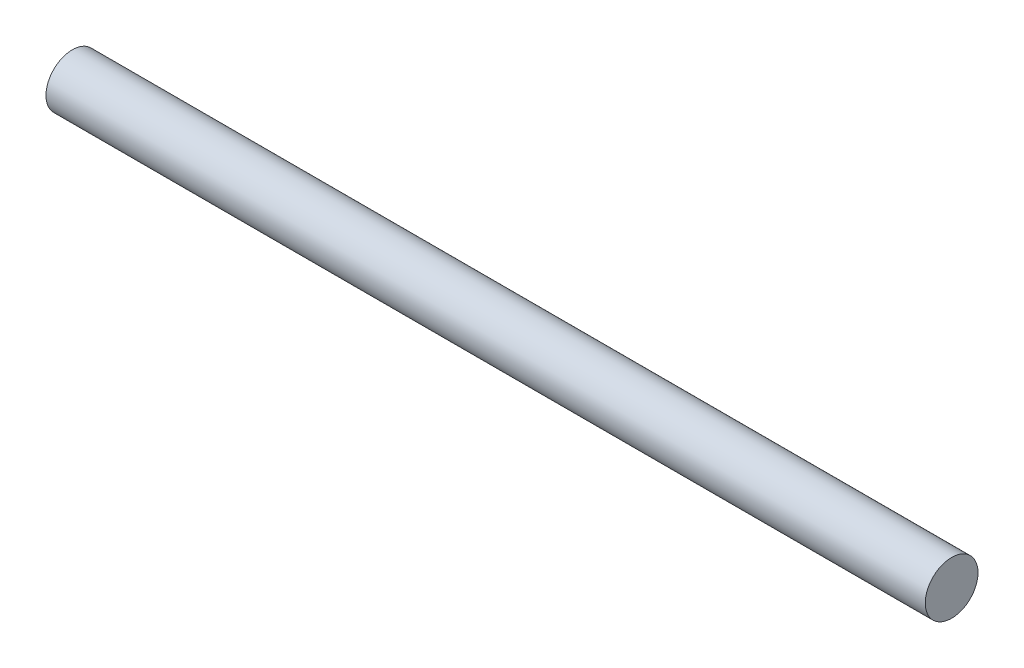
ISO-10303-21;
HEADER;
FILE_DESCRIPTION(('STEP AP214'),'2;1');
FILE_NAME('part.step','',(''),(''),'','','');
FILE_SCHEMA(('AUTOMOTIVE_DESIGN { 1 0 10303 214 1 1 1 1 }'));
ENDSEC;
DATA;
#1=APPLICATION_CONTEXT('core data for automotive mechanical design processes');
#2=APPLICATION_PROTOCOL_DEFINITION('international standard','automotive_design',2000,#1);
#3=PRODUCT_CONTEXT('',#1,'mechanical');
#4=PRODUCT('Part','Part','',(#3));
#5=PRODUCT_RELATED_PRODUCT_CATEGORY('part','',(#4));
#6=PRODUCT_DEFINITION_FORMATION('','',#4);
#7=PRODUCT_DEFINITION_CONTEXT('part definition',#1,'design');
#8=PRODUCT_DEFINITION('design','',#6,#7);
#9=PRODUCT_DEFINITION_SHAPE('','',#8);
#10=(LENGTH_UNIT() NAMED_UNIT(*) SI_UNIT(.MILLI.,.METRE.));
#11=(NAMED_UNIT(*) PLANE_ANGLE_UNIT() SI_UNIT($,.RADIAN.));
#12=(NAMED_UNIT(*) SI_UNIT($,.STERADIAN.) SOLID_ANGLE_UNIT());
#13=UNCERTAINTY_MEASURE_WITH_UNIT(LENGTH_MEASURE(1.E-05),#10,'distance_accuracy_value','');
#14=(GEOMETRIC_REPRESENTATION_CONTEXT(3) GLOBAL_UNCERTAINTY_ASSIGNED_CONTEXT((#13)) GLOBAL_UNIT_ASSIGNED_CONTEXT((#10,
#11,#12)) REPRESENTATION_CONTEXT('',''));
#15=CARTESIAN_POINT('',(0.,0.,0.));
#16=DIRECTION('',(0.,0.,1.));
#17=DIRECTION('',(1.,0.,0.));
#18=AXIS2_PLACEMENT_3D('',#15,#16,#17);
#19=CARTESIAN_POINT('',(200.,0.,0.));
#20=DIRECTION('',(-1.,0.,0.));
#21=DIRECTION('',(0.,0.,1.));
#22=AXIS2_PLACEMENT_3D('',#19,#20,#21);
#23=CYLINDRICAL_SURFACE('',#22,6.);
#24=CARTESIAN_POINT('',(200.,0.,0.));
#25=DIRECTION('',(1.,0.,0.));
#26=DIRECTION('',(0.,0.,-1.));
#27=AXIS2_PLACEMENT_3D('',#24,#25,#26);
#28=CIRCLE('',#27,6.);
#29=CARTESIAN_POINT('',(200.,0.,-6.));
#30=VERTEX_POINT('',#29);
#31=EDGE_CURVE('E10',#30,#30,#28,.T.);
#32=ORIENTED_EDGE('',*,*,#31,.F.);
#33=EDGE_LOOP('',(#32));
#34=FACE_BOUND('',#33,.T.);
#35=CARTESIAN_POINT('',(0.,0.,0.));
#36=DIRECTION('',(1.,0.,0.));
#37=DIRECTION('',(0.,0.,-1.));
#38=AXIS2_PLACEMENT_3D('',#35,#36,#37);
#39=CIRCLE('',#38,6.);
#40=CARTESIAN_POINT('',(0.,0.,-6.));
#41=VERTEX_POINT('',#40);
#42=EDGE_CURVE('E46',#41,#41,#39,.T.);
#43=ORIENTED_EDGE('',*,*,#42,.T.);
#44=EDGE_LOOP('',(#43));
#45=FACE_BOUND('',#44,.T.);
#46=ADVANCED_FACE('F43',(#34,#45),#23,.T.);
#47=CARTESIAN_POINT('',(200.,0.,0.));
#48=DIRECTION('',(1.,0.,0.));
#49=DIRECTION('',(0.,0.,-1.));
#50=AXIS2_PLACEMENT_3D('',#47,#48,#49);
#51=PLANE('',#50);
#52=ORIENTED_EDGE('',*,*,#31,.T.);
#53=EDGE_LOOP('',(#52));
#54=FACE_BOUND('',#53,.T.);
#55=ADVANCED_FACE('F58',(#54),#51,.T.);
#56=CARTESIAN_POINT('',(0.,0.,0.));
#57=DIRECTION('',(1.,0.,0.));
#58=DIRECTION('',(0.,0.,-1.));
#59=AXIS2_PLACEMENT_3D('',#56,#57,#58);
#60=PLANE('',#59);
#61=ORIENTED_EDGE('',*,*,#42,.F.);
#62=EDGE_LOOP('',(#61));
#63=FACE_BOUND('',#62,.T.);
#64=ADVANCED_FACE('F59',(#63),#60,.F.);
#65=CLOSED_SHELL('',(#46,#55,#64));
#66=MANIFOLD_SOLID_BREP('B2',#65);
#67=ADVANCED_BREP_SHAPE_REPRESENTATION('',(#18,#66),#14);
#68=SHAPE_DEFINITION_REPRESENTATION(#9,#67);
ENDSEC;
END-ISO-10303-21;
